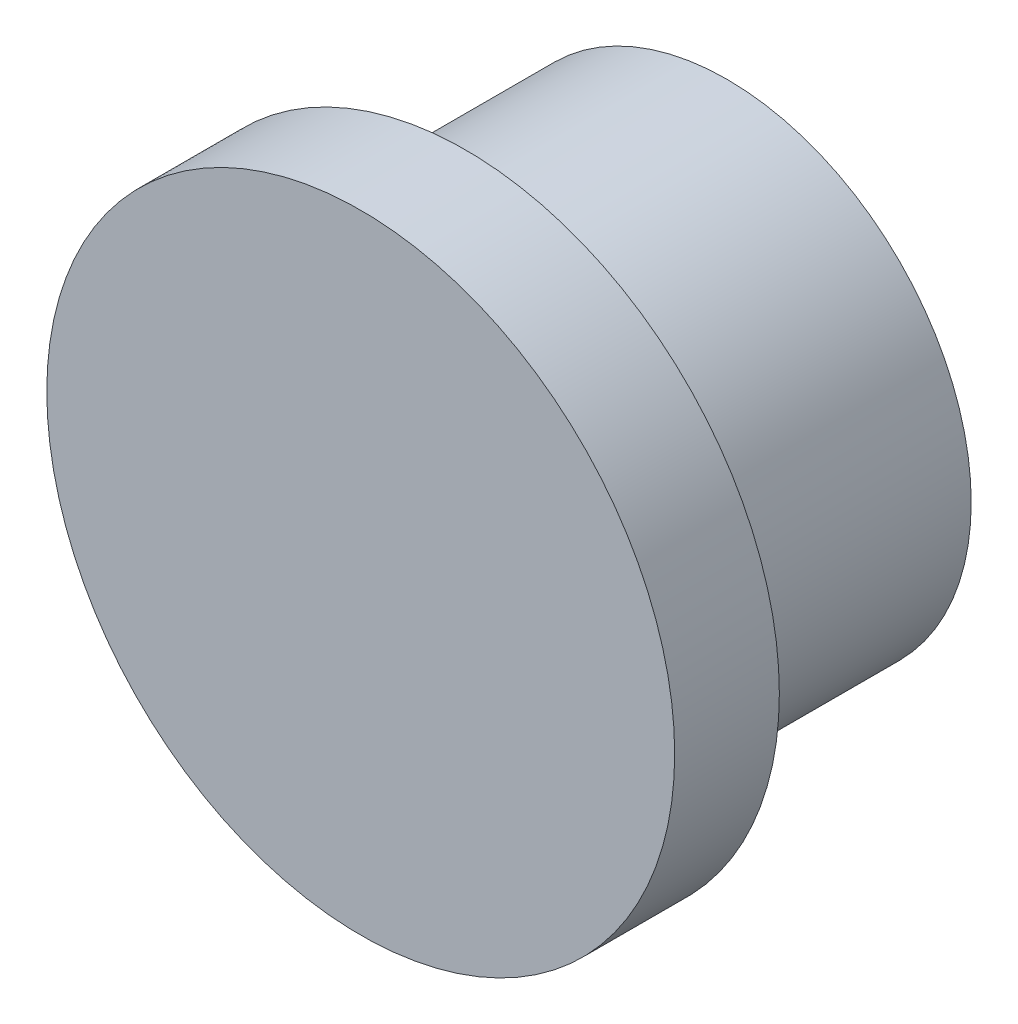
ISO-10303-21;
HEADER;
FILE_DESCRIPTION(('STEP AP214'),'2;1');
FILE_NAME('part.step','',(''),(''),'','','');
FILE_SCHEMA(('AUTOMOTIVE_DESIGN { 1 0 10303 214 1 1 1 1 }'));
ENDSEC;
DATA;
#1=APPLICATION_CONTEXT('core data for automotive mechanical design processes');
#2=APPLICATION_PROTOCOL_DEFINITION('international standard','automotive_design',2000,#1);
#3=PRODUCT_CONTEXT('',#1,'mechanical');
#4=PRODUCT('Part','Part','',(#3));
#5=PRODUCT_RELATED_PRODUCT_CATEGORY('part','',(#4));
#6=PRODUCT_DEFINITION_FORMATION('','',#4);
#7=PRODUCT_DEFINITION_CONTEXT('part definition',#1,'design');
#8=PRODUCT_DEFINITION('design','',#6,#7);
#9=PRODUCT_DEFINITION_SHAPE('','',#8);
#10=(LENGTH_UNIT() NAMED_UNIT(*) SI_UNIT(.MILLI.,.METRE.));
#11=(NAMED_UNIT(*) PLANE_ANGLE_UNIT() SI_UNIT($,.RADIAN.));
#12=(NAMED_UNIT(*) SI_UNIT($,.STERADIAN.) SOLID_ANGLE_UNIT());
#13=UNCERTAINTY_MEASURE_WITH_UNIT(LENGTH_MEASURE(1.E-05),#10,'distance_accuracy_value','');
#14=(GEOMETRIC_REPRESENTATION_CONTEXT(3) GLOBAL_UNCERTAINTY_ASSIGNED_CONTEXT((#13)) GLOBAL_UNIT_ASSIGNED_CONTEXT((#10,
#11,#12)) REPRESENTATION_CONTEXT('',''));
#15=CARTESIAN_POINT('',(0.,0.,0.));
#16=DIRECTION('',(0.,0.,1.));
#17=DIRECTION('',(1.,0.,0.));
#18=AXIS2_PLACEMENT_3D('',#15,#16,#17);
#19=CARTESIAN_POINT('',(-11.5252094902481,-14.6910644370014,1.75));
#20=DIRECTION('',(0.,0.,-1.));
#21=DIRECTION('',(-1.,0.,0.));
#22=AXIS2_PLACEMENT_3D('',#19,#20,#21);
#23=CYLINDRICAL_SURFACE('',#22,3.5);
#24=CARTESIAN_POINT('',(-11.5252094902481,-14.6910644370014,-3.25));
#25=DIRECTION('',(0.,0.,1.));
#26=DIRECTION('',(1.,0.,0.));
#27=AXIS2_PLACEMENT_3D('',#24,#25,#26);
#28=CIRCLE('',#27,3.5);
#29=CARTESIAN_POINT('',(-8.02520949024813,-14.6910644370014,-3.25));
#30=VERTEX_POINT('',#29);
#31=EDGE_CURVE('E37',#30,#30,#28,.T.);
#32=ORIENTED_EDGE('',*,*,#31,.T.);
#33=EDGE_LOOP('',(#32));
#34=FACE_BOUND('',#33,.T.);
#35=CARTESIAN_POINT('',(-11.5252094902481,-14.6910644370014,0.5));
#36=DIRECTION('',(0.,0.,1.));
#37=DIRECTION('',(1.,0.,0.));
#38=AXIS2_PLACEMENT_3D('',#35,#36,#37);
#39=CIRCLE('',#38,3.5);
#40=CARTESIAN_POINT('',(-8.02520949024813,-14.6910644370014,0.5));
#41=VERTEX_POINT('',#40);
#42=EDGE_CURVE('E10',#41,#41,#39,.T.);
#43=ORIENTED_EDGE('',*,*,#42,.F.);
#44=EDGE_LOOP('',(#43));
#45=FACE_BOUND('',#44,.T.);
#46=ADVANCED_FACE('F31',(#34,#45),#23,.T.);
#47=CARTESIAN_POINT('',(-11.5252094902481,-14.6910644370014,-3.25));
#48=DIRECTION('',(0.,0.,1.));
#49=DIRECTION('',(1.,0.,0.));
#50=AXIS2_PLACEMENT_3D('',#47,#48,#49);
#51=PLANE('',#50);
#52=ORIENTED_EDGE('',*,*,#31,.F.);
#53=EDGE_LOOP('',(#52));
#54=FACE_BOUND('',#53,.T.);
#55=ADVANCED_FACE('F63',(#54),#51,.F.);
#56=CARTESIAN_POINT('',(-11.5252094902481,-14.6910644370014,2.));
#57=DIRECTION('',(0.,0.,-1.));
#58=DIRECTION('',(-1.,0.,0.));
#59=AXIS2_PLACEMENT_3D('',#56,#57,#58);
#60=CYLINDRICAL_SURFACE('',#59,4.5);
#61=CARTESIAN_POINT('',(-11.5252094902481,-14.6910644370014,2.));
#62=DIRECTION('',(0.,0.,1.));
#63=DIRECTION('',(1.,0.,0.));
#64=AXIS2_PLACEMENT_3D('',#61,#62,#63);
#65=CIRCLE('',#64,4.5);
#66=CARTESIAN_POINT('',(-7.02520949024813,-14.6910644370014,2.));
#67=VERTEX_POINT('',#66);
#68=EDGE_CURVE('E41',#67,#67,#65,.T.);
#69=ORIENTED_EDGE('',*,*,#68,.F.);
#70=EDGE_LOOP('',(#69));
#71=FACE_BOUND('',#70,.T.);
#72=CARTESIAN_POINT('',(-11.5252094902481,-14.6910644370014,0.5));
#73=DIRECTION('',(0.,0.,1.));
#74=DIRECTION('',(1.,0.,0.));
#75=AXIS2_PLACEMENT_3D('',#72,#73,#74);
#76=CIRCLE('',#75,4.5);
#77=CARTESIAN_POINT('',(-7.02520949024813,-14.6910644370014,0.5));
#78=VERTEX_POINT('',#77);
#79=EDGE_CURVE('E45',#78,#78,#76,.T.);
#80=ORIENTED_EDGE('',*,*,#79,.T.);
#81=EDGE_LOOP('',(#80));
#82=FACE_BOUND('',#81,.T.);
#83=ADVANCED_FACE('F51',(#71,#82),#60,.T.);
#84=CARTESIAN_POINT('',(-11.5252094902481,-14.6910644370014,2.));
#85=DIRECTION('',(0.,0.,1.));
#86=DIRECTION('',(1.,0.,0.));
#87=AXIS2_PLACEMENT_3D('',#84,#85,#86);
#88=PLANE('',#87);
#89=ORIENTED_EDGE('',*,*,#68,.T.);
#90=EDGE_LOOP('',(#89));
#91=FACE_BOUND('',#90,.T.);
#92=ADVANCED_FACE('F55',(#91),#88,.T.);
#93=CARTESIAN_POINT('',(-11.5252094902481,-14.6910644370014,0.5));
#94=DIRECTION('',(0.,0.,1.));
#95=DIRECTION('',(1.,0.,0.));
#96=AXIS2_PLACEMENT_3D('',#93,#94,#95);
#97=PLANE('',#96);
#98=ORIENTED_EDGE('',*,*,#42,.T.);
#99=EDGE_LOOP('',(#98));
#100=FACE_BOUND('',#99,.T.);
#101=ORIENTED_EDGE('',*,*,#79,.F.);
#102=EDGE_LOOP('',(#101));
#103=FACE_BOUND('',#102,.T.);
#104=ADVANCED_FACE('F53',(#100,#103),#97,.F.);
#105=CLOSED_SHELL('',(#46,#55,#83,#92,#104));
#106=MANIFOLD_SOLID_BREP('B2',#105);
#107=ADVANCED_BREP_SHAPE_REPRESENTATION('',(#18,#106),#14);
#108=SHAPE_DEFINITION_REPRESENTATION(#9,#107);
ENDSEC;
END-ISO-10303-21;
